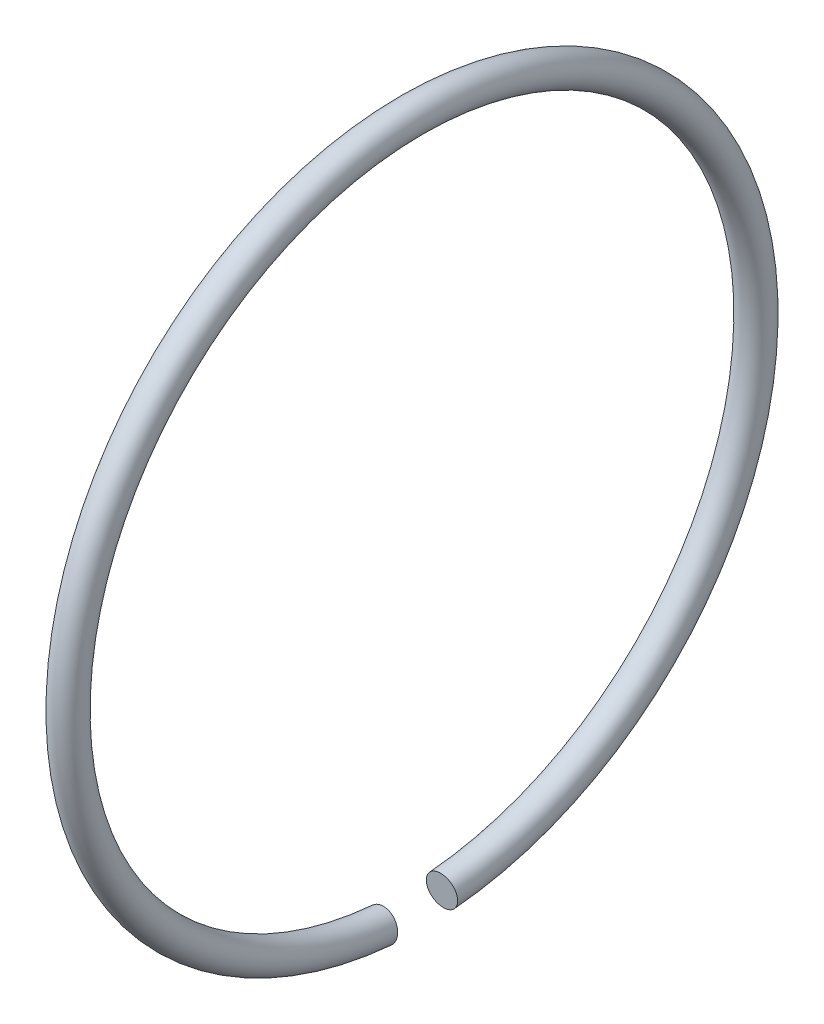
ISO-10303-21;
HEADER;
FILE_DESCRIPTION(('STEP AP214'),'2;1');
FILE_NAME('part.step','',(''),(''),'','','');
FILE_SCHEMA(('AUTOMOTIVE_DESIGN { 1 0 10303 214 1 1 1 1 }'));
ENDSEC;
DATA;
#1=APPLICATION_CONTEXT('core data for automotive mechanical design processes');
#2=APPLICATION_PROTOCOL_DEFINITION('international standard','automotive_design',2000,#1);
#3=PRODUCT_CONTEXT('',#1,'mechanical');
#4=PRODUCT('Part','Part','',(#3));
#5=PRODUCT_RELATED_PRODUCT_CATEGORY('part','',(#4));
#6=PRODUCT_DEFINITION_FORMATION('','',#4);
#7=PRODUCT_DEFINITION_CONTEXT('part definition',#1,'design');
#8=PRODUCT_DEFINITION('design','',#6,#7);
#9=PRODUCT_DEFINITION_SHAPE('','',#8);
#10=(LENGTH_UNIT() NAMED_UNIT(*) SI_UNIT(.MILLI.,.METRE.));
#11=(NAMED_UNIT(*) PLANE_ANGLE_UNIT() SI_UNIT($,.RADIAN.));
#12=(NAMED_UNIT(*) SI_UNIT($,.STERADIAN.) SOLID_ANGLE_UNIT());
#13=UNCERTAINTY_MEASURE_WITH_UNIT(LENGTH_MEASURE(1.E-05),#10,'distance_accuracy_value','');
#14=(GEOMETRIC_REPRESENTATION_CONTEXT(3) GLOBAL_UNCERTAINTY_ASSIGNED_CONTEXT((#13)) GLOBAL_UNIT_ASSIGNED_CONTEXT((#10,
#11,#12)) REPRESENTATION_CONTEXT('',''));
#15=CARTESIAN_POINT('',(0.,0.,0.));
#16=DIRECTION('',(0.,0.,1.));
#17=DIRECTION('',(1.,0.,0.));
#18=AXIS2_PLACEMENT_3D('',#15,#16,#17);
#19=CARTESIAN_POINT('',(0.,0.,0.));
#20=DIRECTION('',(-1.,0.,0.));
#21=DIRECTION('',(0.,0.,1.));
#22=AXIS2_PLACEMENT_3D('',#19,#20,#21);
#23=TOROIDAL_SURFACE('',#22,11.,0.5);
#24=CARTESIAN_POINT('',(0.,-10.9581416790092,0.958713170223987));
#25=DIRECTION('',(0.,-0.0871557427476352,-0.996194698091748));
#26=DIRECTION('',(1.,0.,0.));
#27=AXIS2_PLACEMENT_3D('',#24,#25,#26);
#28=CIRCLE('',#27,0.5);
#29=CARTESIAN_POINT('',(0.,-11.4562390280551,1.0022910415978));
#30=VERTEX_POINT('',#29);
#31=EDGE_CURVE('E10',#30,#30,#28,.T.);
#32=CARTESIAN_POINT('',(0.,-10.9581416790092,-0.958713170223987));
#33=DIRECTION('',(0.,0.0871557427476352,-0.996194698091748));
#34=DIRECTION('',(1.,0.,0.));
#35=AXIS2_PLACEMENT_3D('',#32,#33,#34);
#36=CIRCLE('',#35,0.5);
#37=CARTESIAN_POINT('',(0.,-11.4562390280551,-1.0022910415978));
#38=VERTEX_POINT('',#37);
#39=EDGE_CURVE('E37',#38,#38,#36,.T.);
#40=CARTESIAN_POINT('',(0.,0.,0.));
#41=DIRECTION('',(-1.,0.,0.));
#42=DIRECTION('',(0.,0.,1.));
#43=AXIS2_PLACEMENT_3D('',#40,#41,#42);
#44=CIRCLE('',#43,11.5);
#45=EDGE_CURVE('',#30,#38,#44,.T.);
#46=ORIENTED_EDGE('',*,*,#31,.F.);
#47=ORIENTED_EDGE('',*,*,#39,.T.);
#48=ORIENTED_EDGE('',*,*,#45,.T.);
#49=ORIENTED_EDGE('',*,*,#45,.F.);
#50=EDGE_LOOP('',(#46,#48,#47,#49));
#51=FACE_BOUND('',#50,.T.);
#52=ADVANCED_FACE('F31',(#51),#23,.T.);
#53=CARTESIAN_POINT('',(0.,-10.9581416790092,0.958713170223987));
#54=DIRECTION('',(0.,-0.0871557427476352,-0.996194698091748));
#55=DIRECTION('',(1.,0.,0.));
#56=AXIS2_PLACEMENT_3D('',#53,#54,#55);
#57=PLANE('',#56);
#58=ORIENTED_EDGE('',*,*,#31,.T.);
#59=EDGE_LOOP('',(#58));
#60=FACE_BOUND('',#59,.T.);
#61=ADVANCED_FACE('F46',(#60),#57,.T.);
#62=CARTESIAN_POINT('',(0.,-10.9581416790092,-0.958713170223987));
#63=DIRECTION('',(0.,0.0871557427476352,-0.996194698091748));
#64=DIRECTION('',(1.,0.,0.));
#65=AXIS2_PLACEMENT_3D('',#62,#63,#64);
#66=PLANE('',#65);
#67=ORIENTED_EDGE('',*,*,#39,.F.);
#68=EDGE_LOOP('',(#67));
#69=FACE_BOUND('',#68,.T.);
#70=ADVANCED_FACE('F44',(#69),#66,.F.);
#71=CLOSED_SHELL('',(#52,#61,#70));
#72=MANIFOLD_SOLID_BREP('B2',#71);
#73=ADVANCED_BREP_SHAPE_REPRESENTATION('',(#18,#72),#14);
#74=SHAPE_DEFINITION_REPRESENTATION(#9,#73);
ENDSEC;
END-ISO-10303-21;
